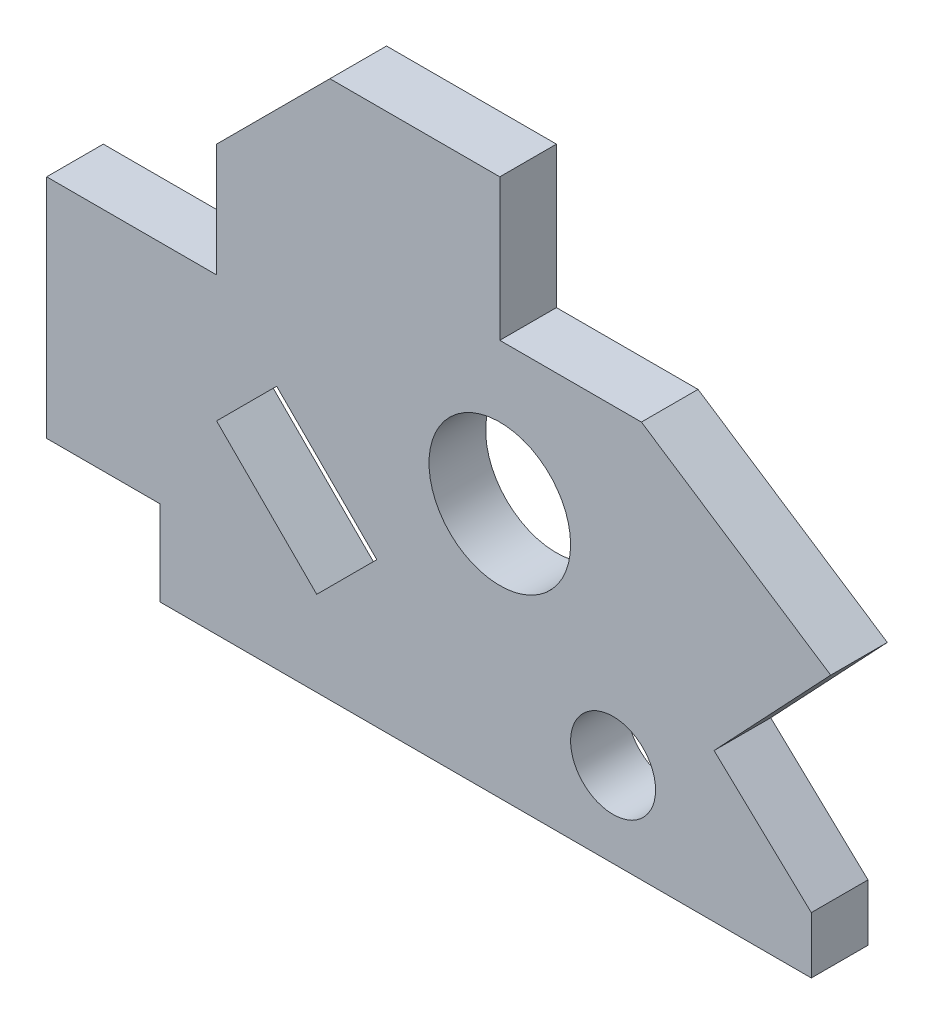
ISO-10303-21;
HEADER;
FILE_DESCRIPTION(('STEP AP214'),'2;1');
FILE_NAME('part.step','',(''),(''),'','','');
FILE_SCHEMA(('AUTOMOTIVE_DESIGN { 1 0 10303 214 1 1 1 1 }'));
ENDSEC;
DATA;
#1=APPLICATION_CONTEXT('core data for automotive mechanical design processes');
#2=APPLICATION_PROTOCOL_DEFINITION('international standard','automotive_design',2000,#1);
#3=PRODUCT_CONTEXT('',#1,'mechanical');
#4=PRODUCT('Part','Part','',(#3));
#5=PRODUCT_RELATED_PRODUCT_CATEGORY('part','',(#4));
#6=PRODUCT_DEFINITION_FORMATION('','',#4);
#7=PRODUCT_DEFINITION_CONTEXT('part definition',#1,'design');
#8=PRODUCT_DEFINITION('design','',#6,#7);
#9=PRODUCT_DEFINITION_SHAPE('','',#8);
#10=(LENGTH_UNIT() NAMED_UNIT(*) SI_UNIT(.MILLI.,.METRE.));
#11=(NAMED_UNIT(*) PLANE_ANGLE_UNIT() SI_UNIT($,.RADIAN.));
#12=(NAMED_UNIT(*) SI_UNIT($,.STERADIAN.) SOLID_ANGLE_UNIT());
#13=UNCERTAINTY_MEASURE_WITH_UNIT(LENGTH_MEASURE(1.E-05),#10,'distance_accuracy_value','');
#14=(GEOMETRIC_REPRESENTATION_CONTEXT(3) GLOBAL_UNCERTAINTY_ASSIGNED_CONTEXT((#13)) GLOBAL_UNIT_ASSIGNED_CONTEXT((#10,
#11,#12)) REPRESENTATION_CONTEXT('',''));
#15=CARTESIAN_POINT('',(0.,0.,0.));
#16=DIRECTION('',(0.,0.,1.));
#17=DIRECTION('',(1.,0.,0.));
#18=AXIS2_PLACEMENT_3D('',#15,#16,#17);
#19=CARTESIAN_POINT('',(0.,0.,10.));
#20=DIRECTION('',(0.,0.,-1.));
#21=DIRECTION('',(-1.,0.,0.));
#22=AXIS2_PLACEMENT_3D('',#19,#20,#21);
#23=PLANE('',#22);
#24=CARTESIAN_POINT('',(-35.,15.,10.));
#25=DIRECTION('',(0.,0.,1.));
#26=DIRECTION('',(1.,0.,0.));
#27=AXIS2_PLACEMENT_3D('',#24,#25,#26);
#28=CIRCLE('',#27,7.5);
#29=CARTESIAN_POINT('',(-27.5,15.,10.));
#30=VERTEX_POINT('',#29);
#31=EDGE_CURVE('E197',#30,#30,#28,.T.);
#32=ORIENTED_EDGE('',*,*,#31,.F.);
#33=EDGE_LOOP('',(#32));
#34=FACE_BOUND('',#33,.T.);
#35=CARTESIAN_POINT('',(-55.,45.,10.));
#36=DIRECTION('',(0.,0.,1.));
#37=DIRECTION('',(1.,0.,0.));
#38=AXIS2_PLACEMENT_3D('',#35,#36,#37);
#39=CIRCLE('',#38,12.5);
#40=CARTESIAN_POINT('',(-42.5,45.,10.));
#41=VERTEX_POINT('',#40);
#42=EDGE_CURVE('E203',#41,#41,#39,.T.);
#43=ORIENTED_EDGE('',*,*,#42,.F.);
#44=EDGE_LOOP('',(#43));
#45=FACE_BOUND('',#44,.T.);
#46=DIRECTION('',(0.,1.,0.));
#47=VECTOR('',#46,1.);
#48=CARTESIAN_POINT('',(0.,10.,10.));
#49=LINE('',#48,#47);
#50=CARTESIAN_POINT('',(0.,0.,10.));
#51=VERTEX_POINT('',#50);
#52=CARTESIAN_POINT('',(0.,10.,10.));
#53=VERTEX_POINT('',#52);
#54=EDGE_CURVE('E209',#51,#53,#49,.T.);
#55=ORIENTED_EDGE('',*,*,#54,.T.);
#56=DIRECTION('',(-0.727361697196045,0.68625429794799,0.));
#57=VECTOR('',#56,1.);
#58=CARTESIAN_POINT('',(-17.168499062538,26.1982082867462,10.));
#59=LINE('',#58,#57);
#60=CARTESIAN_POINT('',(-17.168499062538,26.1982082867462,10.));
#61=VERTEX_POINT('',#60);
#62=EDGE_CURVE('E212',#53,#61,#59,.T.);
#63=ORIENTED_EDGE('',*,*,#62,.T.);
#64=DIRECTION('',(0.686254297947998,0.727361697196038,0.));
#65=VECTOR('',#64,1.);
#66=CARTESIAN_POINT('',(3.41912987590195,48.0190592026273,10.));
#67=LINE('',#66,#65);
#68=CARTESIAN_POINT('',(3.41912987590195,48.0190592026273,10.));
#69=VERTEX_POINT('',#68);
#70=EDGE_CURVE('E215',#61,#69,#67,.T.);
#71=ORIENTED_EDGE('',*,*,#70,.T.);
#72=DIRECTION('',(-0.835478246897547,0.549523519934317,0.));
#73=VECTOR('',#72,1.);
#74=CARTESIAN_POINT('',(-29.9999999999999,70.,10.));
#75=LINE('',#74,#73);
#76=CARTESIAN_POINT('',(-29.9999999999999,70.,10.));
#77=VERTEX_POINT('',#76);
#78=EDGE_CURVE('E217',#69,#77,#75,.T.);
#79=ORIENTED_EDGE('',*,*,#78,.T.);
#80=DIRECTION('',(-1.,0.,0.));
#81=VECTOR('',#80,1.);
#82=CARTESIAN_POINT('',(-54.9999999999999,70.,10.));
#83=LINE('',#82,#81);
#84=CARTESIAN_POINT('',(-54.9999999999999,70.,10.));
#85=VERTEX_POINT('',#84);
#86=EDGE_CURVE('E219',#77,#85,#83,.T.);
#87=ORIENTED_EDGE('',*,*,#86,.T.);
#88=DIRECTION('',(0.,1.,0.));
#89=VECTOR('',#88,1.);
#90=CARTESIAN_POINT('',(-54.9999999999999,95.,10.));
#91=LINE('',#90,#89);
#92=CARTESIAN_POINT('',(-54.9999999999999,95.,10.));
#93=VERTEX_POINT('',#92);
#94=EDGE_CURVE('E221',#85,#93,#91,.T.);
#95=ORIENTED_EDGE('',*,*,#94,.T.);
#96=DIRECTION('',(-1.,0.,0.));
#97=VECTOR('',#96,1.);
#98=CARTESIAN_POINT('',(-84.9999999999999,95.,10.));
#99=LINE('',#98,#97);
#100=CARTESIAN_POINT('',(-84.9999999999999,95.,10.));
#101=VERTEX_POINT('',#100);
#102=EDGE_CURVE('E223',#93,#101,#99,.T.);
#103=ORIENTED_EDGE('',*,*,#102,.T.);
#104=DIRECTION('',(-0.707106781186549,-0.707106781186546,0.));
#105=VECTOR('',#104,1.);
#106=CARTESIAN_POINT('',(-105.,75.,10.));
#107=LINE('',#106,#105);
#108=CARTESIAN_POINT('',(-105.,75.,10.));
#109=VERTEX_POINT('',#108);
#110=EDGE_CURVE('E225',#101,#109,#107,.T.);
#111=ORIENTED_EDGE('',*,*,#110,.T.);
#112=DIRECTION('',(0.,-1.,0.));
#113=VECTOR('',#112,1.);
#114=CARTESIAN_POINT('',(-105.,55.,10.));
#115=LINE('',#114,#113);
#116=CARTESIAN_POINT('',(-105.,55.,10.));
#117=VERTEX_POINT('',#116);
#118=EDGE_CURVE('E227',#109,#117,#115,.T.);
#119=ORIENTED_EDGE('',*,*,#118,.T.);
#120=DIRECTION('',(-1.,0.,0.));
#121=VECTOR('',#120,1.);
#122=CARTESIAN_POINT('',(-135.,55.,10.));
#123=LINE('',#122,#121);
#124=CARTESIAN_POINT('',(-135.,55.,10.));
#125=VERTEX_POINT('',#124);
#126=EDGE_CURVE('E229',#117,#125,#123,.T.);
#127=ORIENTED_EDGE('',*,*,#126,.T.);
#128=DIRECTION('',(0.,-1.,0.));
#129=VECTOR('',#128,1.);
#130=CARTESIAN_POINT('',(-135.,15.,10.));
#131=LINE('',#130,#129);
#132=CARTESIAN_POINT('',(-135.,15.,10.));
#133=VERTEX_POINT('',#132);
#134=EDGE_CURVE('E231',#125,#133,#131,.T.);
#135=ORIENTED_EDGE('',*,*,#134,.T.);
#136=DIRECTION('',(1.,0.,0.));
#137=VECTOR('',#136,1.);
#138=CARTESIAN_POINT('',(-115.,15.,10.));
#139=LINE('',#138,#137);
#140=CARTESIAN_POINT('',(-115.,15.,10.));
#141=VERTEX_POINT('',#140);
#142=EDGE_CURVE('E233',#133,#141,#139,.T.);
#143=ORIENTED_EDGE('',*,*,#142,.T.);
#144=DIRECTION('',(0.,-1.,0.));
#145=VECTOR('',#144,1.);
#146=CARTESIAN_POINT('',(-115.,0.,10.));
#147=LINE('',#146,#145);
#148=CARTESIAN_POINT('',(-115.,0.,10.));
#149=VERTEX_POINT('',#148);
#150=EDGE_CURVE('E235',#141,#149,#147,.T.);
#151=ORIENTED_EDGE('',*,*,#150,.T.);
#152=DIRECTION('',(1.,0.,0.));
#153=VECTOR('',#152,1.);
#154=CARTESIAN_POINT('',(0.,0.,10.));
#155=LINE('',#154,#153);
#156=EDGE_CURVE('E237',#149,#51,#155,.T.);
#157=ORIENTED_EDGE('',*,*,#156,.T.);
#158=EDGE_LOOP('',(#55,#63,#71,#79,#87,#95,#103,#111,#119,#127,#135,#143,#151,#157));
#159=FACE_BOUND('',#158,.T.);
#160=DIRECTION('',(-0.707106781186544,-0.707106781186551,0.));
#161=VECTOR('',#160,1.);
#162=CARTESIAN_POINT('',(-94.393398282202,43.2842712474618,10.));
#163=LINE('',#162,#161);
#164=CARTESIAN_POINT('',(-94.393398282202,43.2842712474618,10.));
#165=VERTEX_POINT('',#164);
#166=CARTESIAN_POINT('',(-105.,32.6776695296636,10.));
#167=VERTEX_POINT('',#166);
#168=EDGE_CURVE('E161',#165,#167,#163,.T.);
#169=ORIENTED_EDGE('',*,*,#168,.F.);
#170=DIRECTION('',(-0.707106781186559,0.707106781186536,0.));
#171=VECTOR('',#170,1.);
#172=CARTESIAN_POINT('',(-76.715728752538,25.6066017177984,10.));
#173=LINE('',#172,#171);
#174=CARTESIAN_POINT('',(-76.715728752538,25.6066017177984,10.));
#175=VERTEX_POINT('',#174);
#176=EDGE_CURVE('E183',#175,#165,#173,.T.);
#177=ORIENTED_EDGE('',*,*,#176,.F.);
#178=DIRECTION('',(0.707106781186545,0.70710678118655,0.));
#179=VECTOR('',#178,1.);
#180=CARTESIAN_POINT('',(-87.3223304703362,15.,10.));
#181=LINE('',#180,#179);
#182=CARTESIAN_POINT('',(-87.3223304703362,15.,10.));
#183=VERTEX_POINT('',#182);
#184=EDGE_CURVE('E181',#183,#175,#181,.T.);
#185=ORIENTED_EDGE('',*,*,#184,.F.);
#186=DIRECTION('',(0.707106781186551,-0.707106781186544,0.));
#187=VECTOR('',#186,1.);
#188=CARTESIAN_POINT('',(-105.,32.6776695296636,10.));
#189=LINE('',#188,#187);
#190=EDGE_CURVE('E169',#167,#183,#189,.T.);
#191=ORIENTED_EDGE('',*,*,#190,.F.);
#192=EDGE_LOOP('',(#169,#177,#185,#191));
#193=FACE_BOUND('',#192,.T.);
#194=ADVANCED_FACE('F36',(#34,#45,#159,#193),#23,.F.);
#195=CARTESIAN_POINT('',(0.,0.,0.));
#196=DIRECTION('',(0.,0.,-1.));
#197=DIRECTION('',(-1.,0.,0.));
#198=AXIS2_PLACEMENT_3D('',#195,#196,#197);
#199=PLANE('',#198);
#200=CARTESIAN_POINT('',(-55.,45.,0.));
#201=DIRECTION('',(0.,0.,1.));
#202=DIRECTION('',(1.,0.,0.));
#203=AXIS2_PLACEMENT_3D('',#200,#201,#202);
#204=CIRCLE('',#203,12.5);
#205=CARTESIAN_POINT('',(-42.5,45.,0.));
#206=VERTEX_POINT('',#205);
#207=EDGE_CURVE('E200',#206,#206,#204,.T.);
#208=ORIENTED_EDGE('',*,*,#207,.T.);
#209=EDGE_LOOP('',(#208));
#210=FACE_BOUND('',#209,.T.);
#211=DIRECTION('',(0.,1.,0.));
#212=VECTOR('',#211,1.);
#213=CARTESIAN_POINT('',(0.,10.,0.));
#214=LINE('',#213,#212);
#215=CARTESIAN_POINT('',(0.,0.,0.));
#216=VERTEX_POINT('',#215);
#217=CARTESIAN_POINT('',(0.,10.,0.));
#218=VERTEX_POINT('',#217);
#219=EDGE_CURVE('E206',#216,#218,#214,.T.);
#220=ORIENTED_EDGE('',*,*,#219,.F.);
#221=DIRECTION('',(1.,0.,0.));
#222=VECTOR('',#221,1.);
#223=CARTESIAN_POINT('',(0.,0.,0.));
#224=LINE('',#223,#222);
#225=CARTESIAN_POINT('',(-115.,0.,0.));
#226=VERTEX_POINT('',#225);
#227=EDGE_CURVE('E213',#226,#216,#224,.T.);
#228=ORIENTED_EDGE('',*,*,#227,.F.);
#229=DIRECTION('',(0.,-1.,0.));
#230=VECTOR('',#229,1.);
#231=CARTESIAN_POINT('',(-115.,0.,0.));
#232=LINE('',#231,#230);
#233=CARTESIAN_POINT('',(-115.,15.,0.));
#234=VERTEX_POINT('',#233);
#235=EDGE_CURVE('E264',#234,#226,#232,.T.);
#236=ORIENTED_EDGE('',*,*,#235,.F.);
#237=DIRECTION('',(1.,0.,0.));
#238=VECTOR('',#237,1.);
#239=CARTESIAN_POINT('',(-115.,15.,0.));
#240=LINE('',#239,#238);
#241=CARTESIAN_POINT('',(-135.,15.,0.));
#242=VERTEX_POINT('',#241);
#243=EDGE_CURVE('E262',#242,#234,#240,.T.);
#244=ORIENTED_EDGE('',*,*,#243,.F.);
#245=DIRECTION('',(0.,-1.,0.));
#246=VECTOR('',#245,1.);
#247=CARTESIAN_POINT('',(-135.,15.,0.));
#248=LINE('',#247,#246);
#249=CARTESIAN_POINT('',(-135.,55.,0.));
#250=VERTEX_POINT('',#249);
#251=EDGE_CURVE('E260',#250,#242,#248,.T.);
#252=ORIENTED_EDGE('',*,*,#251,.F.);
#253=DIRECTION('',(-1.,0.,0.));
#254=VECTOR('',#253,1.);
#255=CARTESIAN_POINT('',(-135.,55.,0.));
#256=LINE('',#255,#254);
#257=CARTESIAN_POINT('',(-105.,55.,0.));
#258=VERTEX_POINT('',#257);
#259=EDGE_CURVE('E258',#258,#250,#256,.T.);
#260=ORIENTED_EDGE('',*,*,#259,.F.);
#261=DIRECTION('',(0.,-1.,0.));
#262=VECTOR('',#261,1.);
#263=CARTESIAN_POINT('',(-105.,55.,0.));
#264=LINE('',#263,#262);
#265=CARTESIAN_POINT('',(-105.,75.,0.));
#266=VERTEX_POINT('',#265);
#267=EDGE_CURVE('E256',#266,#258,#264,.T.);
#268=ORIENTED_EDGE('',*,*,#267,.F.);
#269=DIRECTION('',(-0.707106781186549,-0.707106781186546,0.));
#270=VECTOR('',#269,1.);
#271=CARTESIAN_POINT('',(-105.,75.,0.));
#272=LINE('',#271,#270);
#273=CARTESIAN_POINT('',(-84.9999999999999,95.,0.));
#274=VERTEX_POINT('',#273);
#275=EDGE_CURVE('E254',#274,#266,#272,.T.);
#276=ORIENTED_EDGE('',*,*,#275,.F.);
#277=DIRECTION('',(-1.,0.,0.));
#278=VECTOR('',#277,1.);
#279=CARTESIAN_POINT('',(-84.9999999999999,95.,0.));
#280=LINE('',#279,#278);
#281=CARTESIAN_POINT('',(-54.9999999999999,95.,0.));
#282=VERTEX_POINT('',#281);
#283=EDGE_CURVE('E252',#282,#274,#280,.T.);
#284=ORIENTED_EDGE('',*,*,#283,.F.);
#285=DIRECTION('',(0.,1.,0.));
#286=VECTOR('',#285,1.);
#287=CARTESIAN_POINT('',(-54.9999999999999,95.,0.));
#288=LINE('',#287,#286);
#289=CARTESIAN_POINT('',(-54.9999999999999,70.,0.));
#290=VERTEX_POINT('',#289);
#291=EDGE_CURVE('E250',#290,#282,#288,.T.);
#292=ORIENTED_EDGE('',*,*,#291,.F.);
#293=DIRECTION('',(-1.,0.,0.));
#294=VECTOR('',#293,1.);
#295=CARTESIAN_POINT('',(-54.9999999999999,70.,0.));
#296=LINE('',#295,#294);
#297=CARTESIAN_POINT('',(-29.9999999999999,70.,0.));
#298=VERTEX_POINT('',#297);
#299=EDGE_CURVE('E248',#298,#290,#296,.T.);
#300=ORIENTED_EDGE('',*,*,#299,.F.);
#301=DIRECTION('',(-0.835478246897547,0.549523519934317,0.));
#302=VECTOR('',#301,1.);
#303=CARTESIAN_POINT('',(-29.9999999999999,70.,0.));
#304=LINE('',#303,#302);
#305=CARTESIAN_POINT('',(3.41912987590195,48.0190592026273,0.));
#306=VERTEX_POINT('',#305);
#307=EDGE_CURVE('E246',#306,#298,#304,.T.);
#308=ORIENTED_EDGE('',*,*,#307,.F.);
#309=DIRECTION('',(0.686254297947998,0.727361697196038,0.));
#310=VECTOR('',#309,1.);
#311=CARTESIAN_POINT('',(3.41912987590195,48.0190592026273,0.));
#312=LINE('',#311,#310);
#313=CARTESIAN_POINT('',(-17.168499062538,26.1982082867462,0.));
#314=VERTEX_POINT('',#313);
#315=EDGE_CURVE('E244',#314,#306,#312,.T.);
#316=ORIENTED_EDGE('',*,*,#315,.F.);
#317=DIRECTION('',(-0.727361697196045,0.68625429794799,0.));
#318=VECTOR('',#317,1.);
#319=CARTESIAN_POINT('',(-17.168499062538,26.1982082867462,0.));
#320=LINE('',#319,#318);
#321=EDGE_CURVE('E242',#218,#314,#320,.T.);
#322=ORIENTED_EDGE('',*,*,#321,.F.);
#323=EDGE_LOOP('',(#220,#228,#236,#244,#252,#260,#268,#276,#284,#292,#300,#308,#316,#322));
#324=FACE_BOUND('',#323,.T.);
#325=CARTESIAN_POINT('',(-35.,15.,0.));
#326=DIRECTION('',(0.,0.,1.));
#327=DIRECTION('',(1.,0.,0.));
#328=AXIS2_PLACEMENT_3D('',#325,#326,#327);
#329=CIRCLE('',#328,7.5);
#330=CARTESIAN_POINT('',(-27.5,15.,0.));
#331=VERTEX_POINT('',#330);
#332=EDGE_CURVE('E177',#331,#331,#329,.T.);
#333=ORIENTED_EDGE('',*,*,#332,.T.);
#334=EDGE_LOOP('',(#333));
#335=FACE_BOUND('',#334,.T.);
#336=DIRECTION('',(-0.707106781186559,0.707106781186536,0.));
#337=VECTOR('',#336,1.);
#338=CARTESIAN_POINT('',(-76.715728752538,25.6066017177984,0.));
#339=LINE('',#338,#337);
#340=CARTESIAN_POINT('',(-76.715728752538,25.6066017177984,0.));
#341=VERTEX_POINT('',#340);
#342=CARTESIAN_POINT('',(-94.3933982822019,43.2842712474618,0.));
#343=VERTEX_POINT('',#342);
#344=EDGE_CURVE('E170',#341,#343,#339,.T.);
#345=ORIENTED_EDGE('',*,*,#344,.T.);
#346=DIRECTION('',(-0.707106781186544,-0.707106781186551,0.));
#347=VECTOR('',#346,1.);
#348=CARTESIAN_POINT('',(-94.393398282202,43.2842712474618,0.));
#349=LINE('',#348,#347);
#350=CARTESIAN_POINT('',(-105.,32.6776695296636,0.));
#351=VERTEX_POINT('',#350);
#352=EDGE_CURVE('E59',#343,#351,#349,.T.);
#353=ORIENTED_EDGE('',*,*,#352,.T.);
#354=DIRECTION('',(0.707106781186551,-0.707106781186544,0.));
#355=VECTOR('',#354,1.);
#356=CARTESIAN_POINT('',(-105.,32.6776695296636,0.));
#357=LINE('',#356,#355);
#358=CARTESIAN_POINT('',(-87.3223304703362,15.,0.));
#359=VERTEX_POINT('',#358);
#360=EDGE_CURVE('E176',#351,#359,#357,.T.);
#361=ORIENTED_EDGE('',*,*,#360,.T.);
#362=DIRECTION('',(0.707106781186545,0.70710678118655,0.));
#363=VECTOR('',#362,1.);
#364=CARTESIAN_POINT('',(-87.3223304703362,15.,0.));
#365=LINE('',#364,#363);
#366=EDGE_CURVE('E189',#359,#341,#365,.T.);
#367=ORIENTED_EDGE('',*,*,#366,.T.);
#368=EDGE_LOOP('',(#345,#353,#361,#367));
#369=FACE_BOUND('',#368,.T.);
#370=ADVANCED_FACE('F312',(#210,#324,#335,#369),#199,.T.);
#371=CARTESIAN_POINT('',(0.,10.,10.));
#372=DIRECTION('',(-1.,0.,0.));
#373=DIRECTION('',(0.,-1.,0.));
#374=AXIS2_PLACEMENT_3D('',#371,#372,#373);
#375=PLANE('',#374);
#376=ORIENTED_EDGE('',*,*,#219,.T.);
#377=DIRECTION('',(0.,0.,-1.));
#378=VECTOR('',#377,1.);
#379=CARTESIAN_POINT('',(0.,10.,10.));
#380=LINE('',#379,#378);
#381=EDGE_CURVE('E11',#53,#218,#380,.T.);
#382=ORIENTED_EDGE('',*,*,#381,.F.);
#383=ORIENTED_EDGE('',*,*,#54,.F.);
#384=DIRECTION('',(0.,0.,-1.));
#385=VECTOR('',#384,1.);
#386=CARTESIAN_POINT('',(0.,0.,10.));
#387=LINE('',#386,#385);
#388=EDGE_CURVE('E239',#51,#216,#387,.T.);
#389=ORIENTED_EDGE('',*,*,#388,.T.);
#390=EDGE_LOOP('',(#376,#382,#383,#389));
#391=FACE_BOUND('',#390,.T.);
#392=ADVANCED_FACE('F38',(#391),#375,.F.);
#393=CARTESIAN_POINT('',(-17.168499062538,26.1982082867462,10.));
#394=DIRECTION('',(-0.68625429794799,-0.727361697196045,0.));
#395=DIRECTION('',(0.727361697196045,-0.68625429794799,0.));
#396=AXIS2_PLACEMENT_3D('',#393,#394,#395);
#397=PLANE('',#396);
#398=ORIENTED_EDGE('',*,*,#321,.T.);
#399=DIRECTION('',(0.,0.,-1.));
#400=VECTOR('',#399,1.);
#401=CARTESIAN_POINT('',(-17.168499062538,26.1982082867462,10.));
#402=LINE('',#401,#400);
#403=EDGE_CURVE('E44',#61,#314,#402,.T.);
#404=ORIENTED_EDGE('',*,*,#403,.F.);
#405=ORIENTED_EDGE('',*,*,#62,.F.);
#406=ORIENTED_EDGE('',*,*,#381,.T.);
#407=EDGE_LOOP('',(#398,#404,#405,#406));
#408=FACE_BOUND('',#407,.T.);
#409=ADVANCED_FACE('F329',(#408),#397,.F.);
#410=CARTESIAN_POINT('',(3.41912987590195,48.0190592026273,10.));
#411=DIRECTION('',(-0.727361697196038,0.686254297947998,0.));
#412=DIRECTION('',(-0.686254297947998,-0.727361697196038,0.));
#413=AXIS2_PLACEMENT_3D('',#410,#411,#412);
#414=PLANE('',#413);
#415=ORIENTED_EDGE('',*,*,#315,.T.);
#416=DIRECTION('',(0.,0.,-1.));
#417=VECTOR('',#416,1.);
#418=CARTESIAN_POINT('',(3.41912987590195,48.0190592026273,10.));
#419=LINE('',#418,#417);
#420=EDGE_CURVE('E299',#69,#306,#419,.T.);
#421=ORIENTED_EDGE('',*,*,#420,.F.);
#422=ORIENTED_EDGE('',*,*,#70,.F.);
#423=ORIENTED_EDGE('',*,*,#403,.T.);
#424=EDGE_LOOP('',(#415,#421,#422,#423));
#425=FACE_BOUND('',#424,.T.);
#426=ADVANCED_FACE('F306',(#425),#414,.F.);
#427=CARTESIAN_POINT('',(-29.9999999999999,70.,10.));
#428=DIRECTION('',(-0.549523519934317,-0.835478246897547,0.));
#429=DIRECTION('',(0.835478246897547,-0.549523519934317,0.));
#430=AXIS2_PLACEMENT_3D('',#427,#428,#429);
#431=PLANE('',#430);
#432=ORIENTED_EDGE('',*,*,#307,.T.);
#433=DIRECTION('',(0.,0.,-1.));
#434=VECTOR('',#433,1.);
#435=CARTESIAN_POINT('',(-29.9999999999999,70.,10.));
#436=LINE('',#435,#434);
#437=EDGE_CURVE('E296',#77,#298,#436,.T.);
#438=ORIENTED_EDGE('',*,*,#437,.F.);
#439=ORIENTED_EDGE('',*,*,#78,.F.);
#440=ORIENTED_EDGE('',*,*,#420,.T.);
#441=EDGE_LOOP('',(#432,#438,#439,#440));
#442=FACE_BOUND('',#441,.T.);
#443=ADVANCED_FACE('F318',(#442),#431,.F.);
#444=CARTESIAN_POINT('',(-54.9999999999999,70.,10.));
#445=DIRECTION('',(0.,-1.,0.));
#446=DIRECTION('',(1.,0.,0.));
#447=AXIS2_PLACEMENT_3D('',#444,#445,#446);
#448=PLANE('',#447);
#449=ORIENTED_EDGE('',*,*,#299,.T.);
#450=DIRECTION('',(0.,0.,-1.));
#451=VECTOR('',#450,1.);
#452=CARTESIAN_POINT('',(-54.9999999999999,70.,10.));
#453=LINE('',#452,#451);
#454=EDGE_CURVE('E293',#85,#290,#453,.T.);
#455=ORIENTED_EDGE('',*,*,#454,.F.);
#456=ORIENTED_EDGE('',*,*,#86,.F.);
#457=ORIENTED_EDGE('',*,*,#437,.T.);
#458=EDGE_LOOP('',(#449,#455,#456,#457));
#459=FACE_BOUND('',#458,.T.);
#460=ADVANCED_FACE('F322',(#459),#448,.F.);
#461=CARTESIAN_POINT('',(-54.9999999999999,95.,10.));
#462=DIRECTION('',(-1.,0.,0.));
#463=DIRECTION('',(0.,0.,1.));
#464=AXIS2_PLACEMENT_3D('',#461,#462,#463);
#465=PLANE('',#464);
#466=ORIENTED_EDGE('',*,*,#291,.T.);
#467=DIRECTION('',(0.,0.,-1.));
#468=VECTOR('',#467,1.);
#469=CARTESIAN_POINT('',(-54.9999999999999,95.,10.));
#470=LINE('',#469,#468);
#471=EDGE_CURVE('E290',#93,#282,#470,.T.);
#472=ORIENTED_EDGE('',*,*,#471,.F.);
#473=ORIENTED_EDGE('',*,*,#94,.F.);
#474=ORIENTED_EDGE('',*,*,#454,.T.);
#475=EDGE_LOOP('',(#466,#472,#473,#474));
#476=FACE_BOUND('',#475,.T.);
#477=ADVANCED_FACE('F372',(#476),#465,.F.);
#478=CARTESIAN_POINT('',(-84.9999999999999,95.,10.));
#479=DIRECTION('',(0.,-1.,0.));
#480=DIRECTION('',(0.,0.,-1.));
#481=AXIS2_PLACEMENT_3D('',#478,#479,#480);
#482=PLANE('',#481);
#483=ORIENTED_EDGE('',*,*,#283,.T.);
#484=DIRECTION('',(0.,0.,-1.));
#485=VECTOR('',#484,1.);
#486=CARTESIAN_POINT('',(-84.9999999999999,95.,10.));
#487=LINE('',#486,#485);
#488=EDGE_CURVE('E287',#101,#274,#487,.T.);
#489=ORIENTED_EDGE('',*,*,#488,.F.);
#490=ORIENTED_EDGE('',*,*,#102,.F.);
#491=ORIENTED_EDGE('',*,*,#471,.T.);
#492=EDGE_LOOP('',(#483,#489,#490,#491));
#493=FACE_BOUND('',#492,.T.);
#494=ADVANCED_FACE('F370',(#493),#482,.F.);
#495=CARTESIAN_POINT('',(-105.,75.,10.));
#496=DIRECTION('',(0.707106781186546,-0.707106781186549,0.));
#497=DIRECTION('',(0.707106781186549,0.707106781186546,0.));
#498=AXIS2_PLACEMENT_3D('',#495,#496,#497);
#499=PLANE('',#498);
#500=ORIENTED_EDGE('',*,*,#275,.T.);
#501=DIRECTION('',(0.,0.,-1.));
#502=VECTOR('',#501,1.);
#503=CARTESIAN_POINT('',(-105.,75.,10.));
#504=LINE('',#503,#502);
#505=EDGE_CURVE('E284',#109,#266,#504,.T.);
#506=ORIENTED_EDGE('',*,*,#505,.F.);
#507=ORIENTED_EDGE('',*,*,#110,.F.);
#508=ORIENTED_EDGE('',*,*,#488,.T.);
#509=EDGE_LOOP('',(#500,#506,#507,#508));
#510=FACE_BOUND('',#509,.T.);
#511=ADVANCED_FACE('F365',(#510),#499,.F.);
#512=CARTESIAN_POINT('',(-105.,55.,10.));
#513=DIRECTION('',(1.,0.,0.));
#514=DIRECTION('',(0.,0.,-1.));
#515=AXIS2_PLACEMENT_3D('',#512,#513,#514);
#516=PLANE('',#515);
#517=ORIENTED_EDGE('',*,*,#267,.T.);
#518=DIRECTION('',(0.,0.,-1.));
#519=VECTOR('',#518,1.);
#520=CARTESIAN_POINT('',(-105.,55.,10.));
#521=LINE('',#520,#519);
#522=EDGE_CURVE('E281',#117,#258,#521,.T.);
#523=ORIENTED_EDGE('',*,*,#522,.F.);
#524=ORIENTED_EDGE('',*,*,#118,.F.);
#525=ORIENTED_EDGE('',*,*,#505,.T.);
#526=EDGE_LOOP('',(#517,#523,#524,#525));
#527=FACE_BOUND('',#526,.T.);
#528=ADVANCED_FACE('F360',(#527),#516,.F.);
#529=CARTESIAN_POINT('',(-135.,55.,10.));
#530=DIRECTION('',(0.,-1.,0.));
#531=DIRECTION('',(0.,0.,-1.));
#532=AXIS2_PLACEMENT_3D('',#529,#530,#531);
#533=PLANE('',#532);
#534=ORIENTED_EDGE('',*,*,#259,.T.);
#535=DIRECTION('',(0.,0.,-1.));
#536=VECTOR('',#535,1.);
#537=CARTESIAN_POINT('',(-135.,55.,10.));
#538=LINE('',#537,#536);
#539=EDGE_CURVE('E278',#125,#250,#538,.T.);
#540=ORIENTED_EDGE('',*,*,#539,.F.);
#541=ORIENTED_EDGE('',*,*,#126,.F.);
#542=ORIENTED_EDGE('',*,*,#522,.T.);
#543=EDGE_LOOP('',(#534,#540,#541,#542));
#544=FACE_BOUND('',#543,.T.);
#545=ADVANCED_FACE('F356',(#544),#533,.F.);
#546=CARTESIAN_POINT('',(-135.,15.,10.));
#547=DIRECTION('',(1.,0.,0.));
#548=DIRECTION('',(0.,0.,-1.));
#549=AXIS2_PLACEMENT_3D('',#546,#547,#548);
#550=PLANE('',#549);
#551=ORIENTED_EDGE('',*,*,#251,.T.);
#552=DIRECTION('',(0.,0.,-1.));
#553=VECTOR('',#552,1.);
#554=CARTESIAN_POINT('',(-135.,15.,10.));
#555=LINE('',#554,#553);
#556=EDGE_CURVE('E275',#133,#242,#555,.T.);
#557=ORIENTED_EDGE('',*,*,#556,.F.);
#558=ORIENTED_EDGE('',*,*,#134,.F.);
#559=ORIENTED_EDGE('',*,*,#539,.T.);
#560=EDGE_LOOP('',(#551,#557,#558,#559));
#561=FACE_BOUND('',#560,.T.);
#562=ADVANCED_FACE('F351',(#561),#550,.F.);
#563=CARTESIAN_POINT('',(-115.,15.,10.));
#564=DIRECTION('',(0.,1.,0.));
#565=DIRECTION('',(-1.,0.,0.));
#566=AXIS2_PLACEMENT_3D('',#563,#564,#565);
#567=PLANE('',#566);
#568=ORIENTED_EDGE('',*,*,#243,.T.);
#569=DIRECTION('',(0.,0.,-1.));
#570=VECTOR('',#569,1.);
#571=CARTESIAN_POINT('',(-115.,15.,10.));
#572=LINE('',#571,#570);
#573=EDGE_CURVE('E272',#141,#234,#572,.T.);
#574=ORIENTED_EDGE('',*,*,#573,.F.);
#575=ORIENTED_EDGE('',*,*,#142,.F.);
#576=ORIENTED_EDGE('',*,*,#556,.T.);
#577=EDGE_LOOP('',(#568,#574,#575,#576));
#578=FACE_BOUND('',#577,.T.);
#579=ADVANCED_FACE('F345',(#578),#567,.F.);
#580=CARTESIAN_POINT('',(-115.,0.,10.));
#581=DIRECTION('',(1.,0.,0.));
#582=DIRECTION('',(0.,0.,-1.));
#583=AXIS2_PLACEMENT_3D('',#580,#581,#582);
#584=PLANE('',#583);
#585=ORIENTED_EDGE('',*,*,#235,.T.);
#586=DIRECTION('',(0.,0.,-1.));
#587=VECTOR('',#586,1.);
#588=CARTESIAN_POINT('',(-115.,0.,10.));
#589=LINE('',#588,#587);
#590=EDGE_CURVE('E269',#149,#226,#589,.T.);
#591=ORIENTED_EDGE('',*,*,#590,.F.);
#592=ORIENTED_EDGE('',*,*,#150,.F.);
#593=ORIENTED_EDGE('',*,*,#573,.T.);
#594=EDGE_LOOP('',(#585,#591,#592,#593));
#595=FACE_BOUND('',#594,.T.);
#596=ADVANCED_FACE('F341',(#595),#584,.F.);
#597=CARTESIAN_POINT('',(0.,0.,10.));
#598=DIRECTION('',(0.,1.,0.));
#599=DIRECTION('',(0.,0.,1.));
#600=AXIS2_PLACEMENT_3D('',#597,#598,#599);
#601=PLANE('',#600);
#602=ORIENTED_EDGE('',*,*,#227,.T.);
#603=ORIENTED_EDGE('',*,*,#388,.F.);
#604=ORIENTED_EDGE('',*,*,#156,.F.);
#605=ORIENTED_EDGE('',*,*,#590,.T.);
#606=EDGE_LOOP('',(#602,#603,#604,#605));
#607=FACE_BOUND('',#606,.T.);
#608=ADVANCED_FACE('F336',(#607),#601,.F.);
#609=CARTESIAN_POINT('',(-55.,45.,10.));
#610=DIRECTION('',(0.,0.,-1.));
#611=DIRECTION('',(-1.,0.,0.));
#612=AXIS2_PLACEMENT_3D('',#609,#610,#611);
#613=CYLINDRICAL_SURFACE('',#612,12.5);
#614=ORIENTED_EDGE('',*,*,#42,.T.);
#615=EDGE_LOOP('',(#614));
#616=FACE_BOUND('',#615,.T.);
#617=ORIENTED_EDGE('',*,*,#207,.F.);
#618=EDGE_LOOP('',(#617));
#619=FACE_BOUND('',#618,.T.);
#620=ADVANCED_FACE('F392',(#616,#619),#613,.F.);
#621=CARTESIAN_POINT('',(-35.,15.,10.));
#622=DIRECTION('',(0.,0.,-1.));
#623=DIRECTION('',(-1.,0.,0.));
#624=AXIS2_PLACEMENT_3D('',#621,#622,#623);
#625=CYLINDRICAL_SURFACE('',#624,7.5);
#626=ORIENTED_EDGE('',*,*,#31,.T.);
#627=EDGE_LOOP('',(#626));
#628=FACE_BOUND('',#627,.T.);
#629=ORIENTED_EDGE('',*,*,#332,.F.);
#630=EDGE_LOOP('',(#629));
#631=FACE_BOUND('',#630,.T.);
#632=ADVANCED_FACE('F442',(#628,#631),#625,.F.);
#633=CARTESIAN_POINT('',(-94.393398282202,43.2842712474618,10.));
#634=DIRECTION('',(0.707106781186551,-0.707106781186544,0.));
#635=DIRECTION('',(0.707106781186544,0.707106781186551,0.));
#636=AXIS2_PLACEMENT_3D('',#633,#634,#635);
#637=PLANE('',#636);
#638=ORIENTED_EDGE('',*,*,#352,.F.);
#639=DIRECTION('',(0.,0.,-1.));
#640=VECTOR('',#639,1.);
#641=CARTESIAN_POINT('',(-94.393398282202,43.2842712474618,10.));
#642=LINE('',#641,#640);
#643=EDGE_CURVE('E165',#165,#343,#642,.T.);
#644=ORIENTED_EDGE('',*,*,#643,.F.);
#645=ORIENTED_EDGE('',*,*,#168,.T.);
#646=DIRECTION('',(0.,0.,-1.));
#647=VECTOR('',#646,1.);
#648=CARTESIAN_POINT('',(-105.,32.6776695296636,10.));
#649=LINE('',#648,#647);
#650=EDGE_CURVE('E164',#167,#351,#649,.T.);
#651=ORIENTED_EDGE('',*,*,#650,.T.);
#652=EDGE_LOOP('',(#638,#644,#645,#651));
#653=FACE_BOUND('',#652,.T.);
#654=ADVANCED_FACE('F163',(#653),#637,.T.);
#655=CARTESIAN_POINT('',(-105.,32.6776695296636,10.));
#656=DIRECTION('',(0.707106781186544,0.707106781186551,0.));
#657=DIRECTION('',(-0.707106781186551,0.707106781186544,0.));
#658=AXIS2_PLACEMENT_3D('',#655,#656,#657);
#659=PLANE('',#658);
#660=ORIENTED_EDGE('',*,*,#360,.F.);
#661=ORIENTED_EDGE('',*,*,#650,.F.);
#662=ORIENTED_EDGE('',*,*,#190,.T.);
#663=DIRECTION('',(0.,0.,-1.));
#664=VECTOR('',#663,1.);
#665=CARTESIAN_POINT('',(-87.3223304703362,15.,10.));
#666=LINE('',#665,#664);
#667=EDGE_CURVE('E178',#183,#359,#666,.T.);
#668=ORIENTED_EDGE('',*,*,#667,.T.);
#669=EDGE_LOOP('',(#660,#661,#662,#668));
#670=FACE_BOUND('',#669,.T.);
#671=ADVANCED_FACE('F173',(#670),#659,.T.);
#672=CARTESIAN_POINT('',(-87.3223304703362,15.,10.));
#673=DIRECTION('',(-0.70710678118655,0.707106781186545,0.));
#674=DIRECTION('',(-0.707106781186545,-0.70710678118655,0.));
#675=AXIS2_PLACEMENT_3D('',#672,#673,#674);
#676=PLANE('',#675);
#677=ORIENTED_EDGE('',*,*,#366,.F.);
#678=ORIENTED_EDGE('',*,*,#667,.F.);
#679=ORIENTED_EDGE('',*,*,#184,.T.);
#680=DIRECTION('',(0.,0.,-1.));
#681=VECTOR('',#680,1.);
#682=CARTESIAN_POINT('',(-76.715728752538,25.6066017177984,10.));
#683=LINE('',#682,#681);
#684=EDGE_CURVE('E51',#175,#341,#683,.T.);
#685=ORIENTED_EDGE('',*,*,#684,.T.);
#686=EDGE_LOOP('',(#677,#678,#679,#685));
#687=FACE_BOUND('',#686,.T.);
#688=ADVANCED_FACE('F461',(#687),#676,.T.);
#689=CARTESIAN_POINT('',(-76.715728752538,25.6066017177984,10.));
#690=DIRECTION('',(-0.707106781186536,-0.707106781186559,0.));
#691=DIRECTION('',(0.707106781186559,-0.707106781186536,0.));
#692=AXIS2_PLACEMENT_3D('',#689,#690,#691);
#693=PLANE('',#692);
#694=ORIENTED_EDGE('',*,*,#344,.F.);
#695=ORIENTED_EDGE('',*,*,#684,.F.);
#696=ORIENTED_EDGE('',*,*,#176,.T.);
#697=ORIENTED_EDGE('',*,*,#643,.T.);
#698=EDGE_LOOP('',(#694,#695,#696,#697));
#699=FACE_BOUND('',#698,.T.);
#700=ADVANCED_FACE('F468',(#699),#693,.T.);
#701=CLOSED_SHELL('',(#194,#370,#392,#409,#426,#443,#460,#477,#494,#511,#528,#545,#562,#579,
#596,#608,#620,#632,#654,#671,#688,#700));
#702=MANIFOLD_SOLID_BREP('B2',#701);
#703=ADVANCED_BREP_SHAPE_REPRESENTATION('',(#18,#702),#14);
#704=SHAPE_DEFINITION_REPRESENTATION(#9,#703);
ENDSEC;
END-ISO-10303-21;
